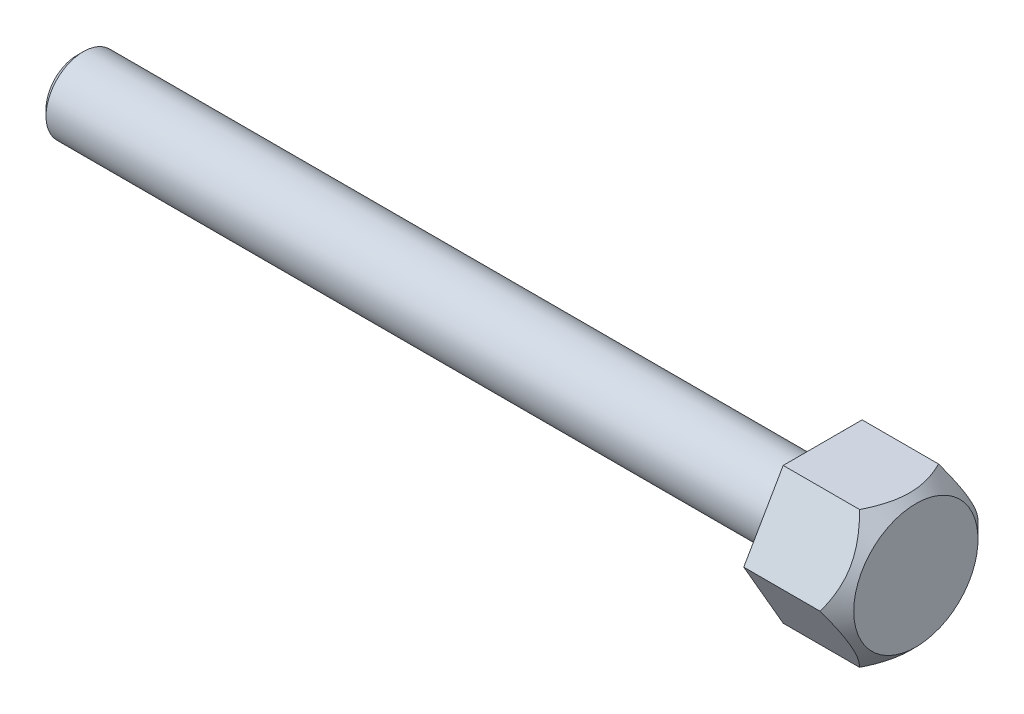
ISO-10303-21;
HEADER;
FILE_DESCRIPTION(('STEP AP214'),'2;1');
FILE_NAME('part.step','',(''),(''),'','','');
FILE_SCHEMA(('AUTOMOTIVE_DESIGN { 1 0 10303 214 1 1 1 1 }'));
ENDSEC;
DATA;
#1=APPLICATION_CONTEXT('core data for automotive mechanical design processes');
#2=APPLICATION_PROTOCOL_DEFINITION('international standard','automotive_design',2000,#1);
#3=PRODUCT_CONTEXT('',#1,'mechanical');
#4=PRODUCT('Part','Part','',(#3));
#5=PRODUCT_RELATED_PRODUCT_CATEGORY('part','',(#4));
#6=PRODUCT_DEFINITION_FORMATION('','',#4);
#7=PRODUCT_DEFINITION_CONTEXT('part definition',#1,'design');
#8=PRODUCT_DEFINITION('design','',#6,#7);
#9=PRODUCT_DEFINITION_SHAPE('','',#8);
#10=(LENGTH_UNIT() NAMED_UNIT(*) SI_UNIT(.MILLI.,.METRE.));
#11=(NAMED_UNIT(*) PLANE_ANGLE_UNIT() SI_UNIT($,.RADIAN.));
#12=(NAMED_UNIT(*) SI_UNIT($,.STERADIAN.) SOLID_ANGLE_UNIT());
#13=UNCERTAINTY_MEASURE_WITH_UNIT(LENGTH_MEASURE(1.E-05),#10,'distance_accuracy_value','');
#14=(GEOMETRIC_REPRESENTATION_CONTEXT(3) GLOBAL_UNCERTAINTY_ASSIGNED_CONTEXT((#13)) GLOBAL_UNIT_ASSIGNED_CONTEXT((#10,
#11,#12)) REPRESENTATION_CONTEXT('',''));
#15=CARTESIAN_POINT('',(0.,0.,0.));
#16=DIRECTION('',(0.,0.,1.));
#17=DIRECTION('',(1.,0.,0.));
#18=AXIS2_PLACEMENT_3D('',#15,#16,#17);
#19=CARTESIAN_POINT('',(-30.,0.,0.));
#20=DIRECTION('',(-1.,0.,0.));
#21=DIRECTION('',(0.,0.,1.));
#22=AXIS2_PLACEMENT_3D('',#19,#20,#21);
#23=CYLINDRICAL_SURFACE('',#22,1.5);
#24=CARTESIAN_POINT('',(-29.75,0.,0.));
#25=DIRECTION('',(-1.,0.,0.));
#26=DIRECTION('',(0.,0.,1.));
#27=AXIS2_PLACEMENT_3D('',#24,#25,#26);
#28=CIRCLE('',#27,1.5);
#29=CARTESIAN_POINT('',(-29.75,0.,1.5));
#30=VERTEX_POINT('',#29);
#31=EDGE_CURVE('E11',#30,#30,#28,.T.);
#32=ORIENTED_EDGE('',*,*,#31,.F.);
#33=EDGE_LOOP('',(#32));
#34=FACE_BOUND('',#33,.T.);
#35=CARTESIAN_POINT('',(0.,0.,0.));
#36=DIRECTION('',(-1.,0.,0.));
#37=DIRECTION('',(0.,0.,1.));
#38=AXIS2_PLACEMENT_3D('',#35,#36,#37);
#39=CIRCLE('',#38,1.5);
#40=CARTESIAN_POINT('',(0.,0.,1.5));
#41=VERTEX_POINT('',#40);
#42=EDGE_CURVE('E144',#41,#41,#39,.T.);
#43=ORIENTED_EDGE('',*,*,#42,.T.);
#44=EDGE_LOOP('',(#43));
#45=FACE_BOUND('',#44,.T.);
#46=ADVANCED_FACE('F40',(#34,#45),#23,.T.);
#47=CARTESIAN_POINT('',(-29.75,0.,0.));
#48=DIRECTION('',(1.,0.,0.));
#49=DIRECTION('',(0.,0.,-1.));
#50=AXIS2_PLACEMENT_3D('',#47,#48,#49);
#51=CONICAL_SURFACE('',#50,1.5,0.785398163397448);
#52=CARTESIAN_POINT('',(-30.,0.,0.));
#53=DIRECTION('',(-1.,0.,0.));
#54=DIRECTION('',(0.,0.,1.));
#55=AXIS2_PLACEMENT_3D('',#52,#53,#54);
#56=CIRCLE('',#55,1.25);
#57=CARTESIAN_POINT('',(-30.,0.,1.25));
#58=VERTEX_POINT('',#57);
#59=EDGE_CURVE('E48',#58,#58,#56,.T.);
#60=ORIENTED_EDGE('',*,*,#59,.F.);
#61=EDGE_LOOP('',(#60));
#62=FACE_BOUND('',#61,.T.);
#63=ORIENTED_EDGE('',*,*,#31,.T.);
#64=EDGE_LOOP('',(#63));
#65=FACE_BOUND('',#64,.T.);
#66=ADVANCED_FACE('F153',(#62,#65),#51,.T.);
#67=CARTESIAN_POINT('',(-30.,1.25,0.));
#68=DIRECTION('',(1.,0.,0.));
#69=DIRECTION('',(0.,0.,-1.));
#70=AXIS2_PLACEMENT_3D('',#67,#68,#69);
#71=PLANE('',#70);
#72=ORIENTED_EDGE('',*,*,#59,.T.);
#73=EDGE_LOOP('',(#72));
#74=FACE_BOUND('',#73,.T.);
#75=ADVANCED_FACE('F151',(#74),#71,.F.);
#76=CARTESIAN_POINT('',(3.75,0.,3.17542648054294));
#77=DIRECTION('',(0.,-0.499999999999997,-0.86602540378444));
#78=DIRECTION('',(0.,0.86602540378444,-0.499999999999997));
#79=AXIS2_PLACEMENT_3D('',#76,#77,#78);
#80=PLANE('',#79);
#81=DIRECTION('',(-1.,0.,0.));
#82=VECTOR('',#81,1.);
#83=CARTESIAN_POINT('',(3.75,0.,3.17542648054294));
#84=LINE('',#83,#82);
#85=CARTESIAN_POINT('',(3.07457351945706,0.,3.17542648054294));
#86=VERTEX_POINT('',#85);
#87=CARTESIAN_POINT('',(0.,0.,3.17542648054294));
#88=VERTEX_POINT('',#87);
#89=EDGE_CURVE('E114',#86,#88,#84,.T.);
#90=ORIENTED_EDGE('',*,*,#89,.F.);
#91=CARTESIAN_POINT('',(3.07445804310509,-0.000200000000009224,3.17554195059678));
#92=CARTESIAN_POINT('',(3.12898900635121,0.0943308997251447,3.12096451019372));
#93=CARTESIAN_POINT('',(3.1803172884173,0.190442479964874,3.06547446347008));
#94=CARTESIAN_POINT('',(3.27429815191942,0.386424562220422,2.95232415552349));
#95=CARTESIAN_POINT('',(3.31689844270939,0.486313702554468,2.89465313346251));
#96=CARTESIAN_POINT('',(3.38987357193505,0.687735384613639,2.77836227110502));
#97=CARTESIAN_POINT('',(3.42043183032172,0.789216629687054,2.71977204694419));
#98=CARTESIAN_POINT('',(3.4675131640141,0.994413197899172,2.60130175305014));
#99=CARTESIAN_POINT('',(3.4840713841007,1.09812225261288,2.54142530239377));
#100=CARTESIAN_POINT('',(3.49901119212363,1.27685963791475,2.43823122487549));
#101=CARTESIAN_POINT('',(3.50122274739977,1.35165706066678,2.39504691271492));
#102=CARTESIAN_POINT('',(3.49749678241252,1.5011296348614,2.30874888176719));
#103=CARTESIAN_POINT('',(3.49155640529112,1.57580473425182,2.26563519303237));
#104=CARTESIAN_POINT('',(3.47186462039656,1.72444981947431,2.17981491306545));
#105=CARTESIAN_POINT('',(3.45810447507259,1.79841892228175,2.13710883164786));
#106=CARTESIAN_POINT('',(3.42352848138478,1.94507802102905,2.052435161507));
#107=CARTESIAN_POINT('',(3.40271317393563,2.01776811458044,2.01046751642768));
#108=CARTESIAN_POINT('',(3.34091972875155,2.20395465431229,1.90297266759402));
#109=CARTESIAN_POINT('',(3.29528419147609,2.31629676656897,1.83811191884129));
#110=CARTESIAN_POINT('',(3.21824536067568,2.48148610419533,1.74273981029546));
#111=CARTESIAN_POINT('',(3.19117749248003,2.53592338410088,1.71131043208804));
#112=CARTESIAN_POINT('',(3.13457434830668,2.64378961648056,1.64903383378716));
#113=CARTESIAN_POINT('',(3.10504058686413,2.69721916353136,1.6181862704147));
#114=CARTESIAN_POINT('',(3.07445804310508,2.7502,1.58759777021764));
#115=B_SPLINE_CURVE_WITH_KNOTS('',3,(#91,#92,#93,#94,#95,#96,#97,#98,#99,#100,#101,#102,#103,
#104,#105,#106,#107,#108,#109,#110,#111,#112,#113,#114),.UNSPECIFIED.,.F.,.F.,(4,2,2,2,2,2,2,2,
2,2,2,4),(0.,0.366307821078204,0.734749902229763,1.09734036165939,1.45901787214334,
1.71784182927394,1.97675651485026,2.23596107357796,2.49514576375462,2.90682558871158,
3.11210731416953,3.31726387159445),.UNSPECIFIED.);
#116=CARTESIAN_POINT('',(3.07457351945706,2.75,1.58771324027148));
#117=VERTEX_POINT('',#116);
#118=EDGE_CURVE('E106',#86,#117,#115,.T.);
#119=ORIENTED_EDGE('',*,*,#118,.T.);
#120=DIRECTION('',(-1.,0.,0.));
#121=VECTOR('',#120,1.);
#122=CARTESIAN_POINT('',(3.75,2.75,1.58771324027148));
#123=LINE('',#122,#121);
#124=CARTESIAN_POINT('',(0.,2.75,1.58771324027148));
#125=VERTEX_POINT('',#124);
#126=EDGE_CURVE('E69',#117,#125,#123,.T.);
#127=ORIENTED_EDGE('',*,*,#126,.T.);
#128=DIRECTION('',(0.,-0.866025403784441,0.499999999999997));
#129=VECTOR('',#128,1.);
#130=CARTESIAN_POINT('',(0.,0.,3.17542648054294));
#131=LINE('',#130,#129);
#132=EDGE_CURVE('E116',#125,#88,#131,.T.);
#133=ORIENTED_EDGE('',*,*,#132,.T.);
#134=EDGE_LOOP('',(#90,#119,#127,#133));
#135=FACE_BOUND('',#134,.T.);
#136=ADVANCED_FACE('F113',(#135),#80,.F.);
#137=CARTESIAN_POINT('',(3.75,-2.75,1.58771324027147));
#138=DIRECTION('',(0.,0.500000000000002,-0.866025403784438));
#139=DIRECTION('',(0.,0.866025403784438,0.500000000000002));
#140=AXIS2_PLACEMENT_3D('',#137,#138,#139);
#141=PLANE('',#140);
#142=DIRECTION('',(-1.,0.,0.));
#143=VECTOR('',#142,1.);
#144=CARTESIAN_POINT('',(3.75,-2.75,1.58771324027147));
#145=LINE('',#144,#143);
#146=CARTESIAN_POINT('',(3.07457351945706,-2.75,1.58771324027147));
#147=VERTEX_POINT('',#146);
#148=CARTESIAN_POINT('',(0.,-2.75,1.58771324027147));
#149=VERTEX_POINT('',#148);
#150=EDGE_CURVE('E139',#147,#149,#145,.T.);
#151=ORIENTED_EDGE('',*,*,#150,.F.);
#152=CARTESIAN_POINT('',(3.07445804310508,-2.7502,1.58759777021763));
#153=CARTESIAN_POINT('',(3.12898900635121,-2.65566910027485,1.64217521062068));
#154=CARTESIAN_POINT('',(3.1803172884173,-2.55955752003512,1.69766525734433));
#155=CARTESIAN_POINT('',(3.27429815191942,-2.36357543777957,1.81081556529092));
#156=CARTESIAN_POINT('',(3.31689844270939,-2.26368629744553,1.8684865873519));
#157=CARTESIAN_POINT('',(3.38987357193505,-2.06226461538635,1.98477744970939));
#158=CARTESIAN_POINT('',(3.42043183032172,-1.96078337031294,2.04336767387022));
#159=CARTESIAN_POINT('',(3.4675131640141,-1.75558680210082,2.16183796776428));
#160=CARTESIAN_POINT('',(3.4840713841007,-1.65187774738711,2.22171441842064));
#161=CARTESIAN_POINT('',(3.49901119212363,-1.47314036208525,2.32490849593892));
#162=CARTESIAN_POINT('',(3.50122274739977,-1.39834293933321,2.3680928080995));
#163=CARTESIAN_POINT('',(3.49749678241252,-1.24887036513859,2.45439083904723));
#164=CARTESIAN_POINT('',(3.49155640529112,-1.17419526574817,2.49750452778205));
#165=CARTESIAN_POINT('',(3.47186462039656,-1.02555018052568,2.58332480774897));
#166=CARTESIAN_POINT('',(3.45810447507259,-0.951581077718252,2.62603088916656));
#167=CARTESIAN_POINT('',(3.42352848138478,-0.804921978970943,2.71070455930742));
#168=CARTESIAN_POINT('',(3.40271317393563,-0.732231885419558,2.75267220438673));
#169=CARTESIAN_POINT('',(3.34091972875155,-0.546045345687715,2.8601670532204));
#170=CARTESIAN_POINT('',(3.29528419147609,-0.433703233431031,2.92502780197313));
#171=CARTESIAN_POINT('',(3.21824536067568,-0.268513895804676,3.02039991051896));
#172=CARTESIAN_POINT('',(3.19117749248003,-0.214076615899126,3.05182928872638));
#173=CARTESIAN_POINT('',(3.13457434830669,-0.106210383519449,3.11410588702726));
#174=CARTESIAN_POINT('',(3.10504058686414,-0.0527808364686495,3.14495345039972));
#175=CARTESIAN_POINT('',(3.07445804310508,0.000199999999990615,3.17554195059678));
#176=B_SPLINE_CURVE_WITH_KNOTS('',3,(#152,#153,#154,#155,#156,#157,#158,#159,#160,#161,#162,
#163,#164,#165,#166,#167,#168,#169,#170,#171,#172,#173,#174,#175),.UNSPECIFIED.,.F.,.F.,(4,2,2,
2,2,2,2,2,2,2,2,4),(0.,0.366307821078203,0.734749902229761,1.09734036165938,1.45901787214334,
1.71784182927394,1.97675651485026,2.23596107357796,2.49514576375462,2.90682558871157,
3.11210731416952,3.31726387159444),.UNSPECIFIED.);
#177=EDGE_CURVE('E117',#147,#86,#176,.T.);
#178=ORIENTED_EDGE('',*,*,#177,.T.);
#179=ORIENTED_EDGE('',*,*,#89,.T.);
#180=DIRECTION('',(0.,-0.866025403784438,-0.500000000000002));
#181=VECTOR('',#180,1.);
#182=CARTESIAN_POINT('',(0.,-2.75,1.58771324027147));
#183=LINE('',#182,#181);
#184=EDGE_CURVE('E171',#88,#149,#183,.T.);
#185=ORIENTED_EDGE('',*,*,#184,.T.);
#186=EDGE_LOOP('',(#151,#178,#179,#185));
#187=FACE_BOUND('',#186,.T.);
#188=ADVANCED_FACE('F208',(#187),#141,.F.);
#189=CARTESIAN_POINT('',(3.75,-2.75,-1.58771324027147));
#190=DIRECTION('',(0.,1.,0.));
#191=DIRECTION('',(0.,0.,1.));
#192=AXIS2_PLACEMENT_3D('',#189,#190,#191);
#193=PLANE('',#192);
#194=DIRECTION('',(-1.,0.,0.));
#195=VECTOR('',#194,1.);
#196=CARTESIAN_POINT('',(3.75,-2.75,-1.58771324027147));
#197=LINE('',#196,#195);
#198=CARTESIAN_POINT('',(3.07457351945706,-2.75,-1.58771324027146));
#199=VERTEX_POINT('',#198);
#200=CARTESIAN_POINT('',(0.,-2.75,-1.58771324027147));
#201=VERTEX_POINT('',#200);
#202=EDGE_CURVE('E136',#199,#201,#197,.T.);
#203=ORIENTED_EDGE('',*,*,#202,.F.);
#204=CARTESIAN_POINT('',(1.99796899816714,-2.75,-3.24303370943747));
#205=CARTESIAN_POINT('',(2.05792601351629,-2.75,-3.16440464354934));
#206=CARTESIAN_POINT('',(2.11732610366244,-2.75,-3.08534400989006));
#207=CARTESIAN_POINT('',(2.23476039442893,-2.75,-2.92618611607515));
#208=CARTESIAN_POINT('',(2.29279425913588,-2.75,-2.84608860833369));
#209=CARTESIAN_POINT('',(2.40765708305725,-2.75,-2.6840975876423));
#210=CARTESIAN_POINT('',(2.46447325222763,-2.75,-2.60219497539475));
#211=CARTESIAN_POINT('',(2.57606157049973,-2.75,-2.43701336834121));
#212=CARTESIAN_POINT('',(2.63083386198774,-2.75,-2.35373446999928));
#213=CARTESIAN_POINT('',(2.74111497586007,-2.75,-2.18048311482057));
#214=CARTESIAN_POINT('',(2.79646756057042,-2.75,-2.09041070178267));
#215=CARTESIAN_POINT('',(2.90362457119406,-2.75,-1.90818242797483));
#216=CARTESIAN_POINT('',(2.95542946223493,-2.75,-1.81602684243877));
#217=CARTESIAN_POINT('',(3.05440622300766,-2.75,-1.62958382628412));
#218=CARTESIAN_POINT('',(3.1015910729887,-2.75,-1.53530334084137));
#219=CARTESIAN_POINT('',(3.19026228978302,-2.75,-1.34412102412683));
#220=CARTESIAN_POINT('',(3.23175129415731,-2.75,-1.24722043119359));
#221=CARTESIAN_POINT('',(3.30411968595675,-2.75,-1.05948785067354));
#222=CARTESIAN_POINT('',(3.33561858326727,-2.75,-0.968897149313561));
#223=CARTESIAN_POINT('',(3.39135824728334,-2.75,-0.785467841373158));
#224=CARTESIAN_POINT('',(3.41559853460604,-2.75,-0.692629086761245));
#225=CARTESIAN_POINT('',(3.45512777684662,-2.75,-0.50683975692026));
#226=CARTESIAN_POINT('',(3.47057487632076,-2.75,-0.413923395972729));
#227=CARTESIAN_POINT('',(3.49220567685045,-2.75,-0.22701279953092));
#228=CARTESIAN_POINT('',(3.49839113663418,-2.75,-0.133018772095714));
#229=CARTESIAN_POINT('',(3.50100371070673,-2.75,0.0513429538859794));
#230=CARTESIAN_POINT('',(3.49781117045462,-2.75,0.141705353642122));
#231=CARTESIAN_POINT('',(3.48270177246004,-2.75,0.321692287968609));
#232=CARTESIAN_POINT('',(3.4707840947253,-2.75,0.41131675238684));
#233=CARTESIAN_POINT('',(3.43868525691676,-2.75,0.590699065944813));
#234=CARTESIAN_POINT('',(3.41836074081776,-2.75,0.680430876320569));
#235=CARTESIAN_POINT('',(3.37055150794747,-2.75,0.857919963832991));
#236=CARTESIAN_POINT('',(3.34306729139305,-2.75,0.945677378446888));
#237=CARTESIAN_POINT('',(3.24716604265501,-2.75,1.2186050784306));
#238=CARTESIAN_POINT('',(3.1679688089688,-2.75,1.40000061415541));
#239=CARTESIAN_POINT('',(3.03590694470477,-2.75,1.66546648497212));
#240=CARTESIAN_POINT('',(2.98957204231885,-2.75,1.75301456708629));
#241=CARTESIAN_POINT('',(2.89332337929579,-2.75,1.92612568568624));
#242=CARTESIAN_POINT('',(2.84341025493044,-2.75,2.0116890715227));
#243=CARTESIAN_POINT('',(2.74326865191949,-2.75,2.17686915216543));
#244=CARTESIAN_POINT('',(2.69317821419991,-2.75,2.25657049342917));
#245=CARTESIAN_POINT('',(2.59087486054964,-2.75,2.41460602096669));
#246=CARTESIAN_POINT('',(2.5386617847215,-2.75,2.49294010360777));
#247=CARTESIAN_POINT('',(2.43292123737265,-2.75,2.6477857504496));
#248=CARTESIAN_POINT('',(2.37940777564859,-2.75,2.72430692145753));
#249=CARTESIAN_POINT('',(2.27095458564275,-2.75,2.87630117770402));
#250=CARTESIAN_POINT('',(2.21601525425193,-2.75,2.95177454580816));
#251=CARTESIAN_POINT('',(2.16049241439691,-2.75,3.02680892900513));
#252=B_SPLINE_CURVE_WITH_KNOTS('',3,(#204,#205,#206,#207,#208,#209,#210,#211,#212,#213,#214,
#215,#216,#217,#218,#219,#220,#221,#222,#223,#224,#225,#226,#227,#228,#229,#230,#231,#232,#233,
#234,#235,#236,#237,#238,#239,#240,#241,#242,#243,#244,#245,#246,#247,#248,#249,#250,#251),
.UNSPECIFIED.,.F.,.F.,(4,2,2,2,2,2,2,2,2,2,2,2,2,2,2,2,2,2,2,2,2,2,2,4),(0.,0.296647452352641,
0.593367095252204,0.892381571184982,1.19137517730117,1.50847400391387,1.825531176732,
2.14167033508796,2.45766260229171,2.74514441288885,3.03264520555955,3.31479719971051,
3.59689560814222,3.86771287044473,4.1385555875406,4.41422075736493,4.68986667283603,
5.28181864775793,5.57895450339726,5.87603765340491,6.15840777135868,6.44079919969468,
6.72091143439138,7.00094651879013),.UNSPECIFIED.);
#253=EDGE_CURVE('E205',#199,#147,#252,.T.);
#254=ORIENTED_EDGE('',*,*,#253,.T.);
#255=ORIENTED_EDGE('',*,*,#150,.T.);
#256=DIRECTION('',(0.,0.,-1.));
#257=VECTOR('',#256,1.);
#258=CARTESIAN_POINT('',(0.,-2.75,-1.58771324027147));
#259=LINE('',#258,#257);
#260=EDGE_CURVE('E176',#149,#201,#259,.T.);
#261=ORIENTED_EDGE('',*,*,#260,.T.);
#262=EDGE_LOOP('',(#203,#254,#255,#261));
#263=FACE_BOUND('',#262,.T.);
#264=ADVANCED_FACE('F204',(#263),#193,.F.);
#265=CARTESIAN_POINT('',(3.75,0.,-3.17542648054294));
#266=DIRECTION('',(0.,0.500000000000003,0.866025403784437));
#267=DIRECTION('',(0.,-0.866025403784437,0.500000000000003));
#268=AXIS2_PLACEMENT_3D('',#265,#266,#267);
#269=PLANE('',#268);
#270=DIRECTION('',(-1.,0.,0.));
#271=VECTOR('',#270,1.);
#272=CARTESIAN_POINT('',(3.75,0.,-3.17542648054294));
#273=LINE('',#272,#271);
#274=CARTESIAN_POINT('',(3.07457351945706,0.,-3.17542648054294));
#275=VERTEX_POINT('',#274);
#276=CARTESIAN_POINT('',(0.,0.,-3.17542648054294));
#277=VERTEX_POINT('',#276);
#278=EDGE_CURVE('E128',#275,#277,#273,.T.);
#279=ORIENTED_EDGE('',*,*,#278,.F.);
#280=CARTESIAN_POINT('',(3.07445804310509,0.000199999999981359,-3.17554195059677));
#281=CARTESIAN_POINT('',(3.12898900635121,-0.0943308997251722,-3.12096451019372));
#282=CARTESIAN_POINT('',(3.18031728841731,-0.190442479964901,-3.06547446347007));
#283=CARTESIAN_POINT('',(3.27429815191942,-0.386424562220447,-2.95232415552349));
#284=CARTESIAN_POINT('',(3.31689844270939,-0.486313702554493,-2.8946531334625));
#285=CARTESIAN_POINT('',(3.38987357193505,-0.687735384613663,-2.77836227110501));
#286=CARTESIAN_POINT('',(3.42043183032172,-0.789216629687077,-2.71977204694418));
#287=CARTESIAN_POINT('',(3.4675131640141,-0.994413197899193,-2.60130175305013));
#288=CARTESIAN_POINT('',(3.4840713841007,-1.0981222526129,-2.54142530239376));
#289=CARTESIAN_POINT('',(3.49901119212363,-1.27685963791477,-2.43823122487548));
#290=CARTESIAN_POINT('',(3.50122274739977,-1.3516570606668,-2.3950469127149));
#291=CARTESIAN_POINT('',(3.49749678241252,-1.50112963486142,-2.30874888176717));
#292=CARTESIAN_POINT('',(3.49155640529112,-1.57580473425184,-2.26563519303235));
#293=CARTESIAN_POINT('',(3.47186462039656,-1.72444981947433,-2.17981491306543));
#294=CARTESIAN_POINT('',(3.45810447507259,-1.79841892228176,-2.13710883164785));
#295=CARTESIAN_POINT('',(3.42352848138478,-1.94507802102907,-2.05243516150698));
#296=CARTESIAN_POINT('',(3.40271317393563,-2.01776811458046,-2.01046751642767));
#297=CARTESIAN_POINT('',(3.34091972875155,-2.2039546543123,-1.902972667594));
#298=CARTESIAN_POINT('',(3.29528419147609,-2.31629676656898,-1.83811191884127));
#299=CARTESIAN_POINT('',(3.21824536067568,-2.48148610419534,-1.74273981029544));
#300=CARTESIAN_POINT('',(3.19117749248004,-2.53592338410089,-1.71131043208802));
#301=CARTESIAN_POINT('',(3.13457434830669,-2.64378961648056,-1.64903383378714));
#302=CARTESIAN_POINT('',(3.10504058686414,-2.69721916353136,-1.61818627041469));
#303=CARTESIAN_POINT('',(3.07445804310509,-2.7502,-1.58759777021762));
#304=B_SPLINE_CURVE_WITH_KNOTS('',3,(#280,#281,#282,#283,#284,#285,#286,#287,#288,#289,#290,
#291,#292,#293,#294,#295,#296,#297,#298,#299,#300,#301,#302,#303),.UNSPECIFIED.,.F.,.F.,(4,2,2,
2,2,2,2,2,2,2,2,4),(0.,0.366307821078203,0.734749902229761,1.09734036165938,1.45901787214333,
1.71784182927394,1.97675651485026,2.23596107357795,2.49514576375461,2.90682558871157,
3.11210731416952,3.31726387159443),.UNSPECIFIED.);
#305=EDGE_CURVE('E201',#275,#199,#304,.T.);
#306=ORIENTED_EDGE('',*,*,#305,.T.);
#307=ORIENTED_EDGE('',*,*,#202,.T.);
#308=DIRECTION('',(0.,0.866025403784437,-0.500000000000003));
#309=VECTOR('',#308,1.);
#310=CARTESIAN_POINT('',(0.,0.,-3.17542648054294));
#311=LINE('',#310,#309);
#312=EDGE_CURVE('E188',#201,#277,#311,.T.);
#313=ORIENTED_EDGE('',*,*,#312,.T.);
#314=EDGE_LOOP('',(#279,#306,#307,#313));
#315=FACE_BOUND('',#314,.T.);
#316=ADVANCED_FACE('F198',(#315),#269,.F.);
#317=CARTESIAN_POINT('',(3.75,2.75,-1.58771324027147));
#318=DIRECTION('',(0.,-0.499999999999997,0.866025403784441));
#319=DIRECTION('',(0.,-0.866025403784441,-0.499999999999997));
#320=AXIS2_PLACEMENT_3D('',#317,#318,#319);
#321=PLANE('',#320);
#322=DIRECTION('',(-1.,0.,0.));
#323=VECTOR('',#322,1.);
#324=CARTESIAN_POINT('',(3.75,2.75,-1.58771324027147));
#325=LINE('',#324,#323);
#326=CARTESIAN_POINT('',(3.07457351945706,2.75,-1.58771324027147));
#327=VERTEX_POINT('',#326);
#328=CARTESIAN_POINT('',(0.,2.75,-1.58771324027147));
#329=VERTEX_POINT('',#328);
#330=EDGE_CURVE('E124',#327,#329,#325,.T.);
#331=ORIENTED_EDGE('',*,*,#330,.F.);
#332=CARTESIAN_POINT('',(3.07445804310508,2.7502,-1.58759777021763));
#333=CARTESIAN_POINT('',(3.12898900635121,2.65566910027484,-1.64217521062069));
#334=CARTESIAN_POINT('',(3.18031728841731,2.55955752003512,-1.69766525734433));
#335=CARTESIAN_POINT('',(3.27429815191942,2.36357543777957,-1.81081556529092));
#336=CARTESIAN_POINT('',(3.31689844270939,2.26368629744552,-1.8684865873519));
#337=CARTESIAN_POINT('',(3.38987357193505,2.06226461538635,-1.98477744970939));
#338=CARTESIAN_POINT('',(3.42043183032172,1.96078337031293,-2.04336767387022));
#339=CARTESIAN_POINT('',(3.46751316401411,1.75558680210081,-2.16183796776428));
#340=CARTESIAN_POINT('',(3.48407138410071,1.6518777473871,-2.22171441842064));
#341=CARTESIAN_POINT('',(3.49901119212364,1.47314036208523,-2.32490849593892));
#342=CARTESIAN_POINT('',(3.50122274739978,1.3983429393332,-2.3680928080995));
#343=CARTESIAN_POINT('',(3.49749678241253,1.24887036513858,-2.45439083904723));
#344=CARTESIAN_POINT('',(3.49155640529113,1.17419526574816,-2.49750452778205));
#345=CARTESIAN_POINT('',(3.47186462039657,1.02555018052567,-2.58332480774897));
#346=CARTESIAN_POINT('',(3.4581044750726,0.951581077718235,-2.62603088916655));
#347=CARTESIAN_POINT('',(3.42352848138479,0.804921978970927,-2.71070455930742));
#348=CARTESIAN_POINT('',(3.40271317393564,0.732231885419541,-2.75267220438673));
#349=CARTESIAN_POINT('',(3.34091972875156,0.546045345687696,-2.86016705322039));
#350=CARTESIAN_POINT('',(3.2952841914761,0.43370323343101,-2.92502780197312));
#351=CARTESIAN_POINT('',(3.21824536067569,0.268513895804652,-3.02039991051895));
#352=CARTESIAN_POINT('',(3.19117749248004,0.214076615899101,-3.05182928872638));
#353=CARTESIAN_POINT('',(3.13457434830669,0.106210383519422,-3.11410588702725));
#354=CARTESIAN_POINT('',(3.10504058686414,0.0527808364686221,-3.14495345039971));
#355=CARTESIAN_POINT('',(3.07445804310509,-0.000200000000018948,-3.17554195059677));
#356=B_SPLINE_CURVE_WITH_KNOTS('',3,(#332,#333,#334,#335,#336,#337,#338,#339,#340,#341,#342,
#343,#344,#345,#346,#347,#348,#349,#350,#351,#352,#353,#354,#355),.UNSPECIFIED.,.F.,.F.,(4,2,2,
2,2,2,2,2,2,2,2,4),(0.,0.366307821078207,0.734749902229769,1.0973403616594,1.45901787214335,
1.71784182927396,1.97675651485027,2.23596107357797,2.49514576375463,2.90682558871159,
3.11210731416954,3.31726387159446),.UNSPECIFIED.);
#357=EDGE_CURVE('E58',#327,#275,#356,.T.);
#358=ORIENTED_EDGE('',*,*,#357,.T.);
#359=ORIENTED_EDGE('',*,*,#278,.T.);
#360=DIRECTION('',(0.,0.866025403784441,0.499999999999997));
#361=VECTOR('',#360,1.);
#362=CARTESIAN_POINT('',(0.,2.75,-1.58771324027147));
#363=LINE('',#362,#361);
#364=EDGE_CURVE('E130',#277,#329,#363,.T.);
#365=ORIENTED_EDGE('',*,*,#364,.T.);
#366=EDGE_LOOP('',(#331,#358,#359,#365));
#367=FACE_BOUND('',#366,.T.);
#368=ADVANCED_FACE('F194',(#367),#321,.F.);
#369=CARTESIAN_POINT('',(3.75,2.75,1.58771324027148));
#370=DIRECTION('',(0.,-1.,0.));
#371=DIRECTION('',(0.,0.,-1.));
#372=AXIS2_PLACEMENT_3D('',#369,#370,#371);
#373=PLANE('',#372);
#374=ORIENTED_EDGE('',*,*,#126,.F.);
#375=CARTESIAN_POINT('',(1.99796899816714,2.75,-3.24303370943747));
#376=CARTESIAN_POINT('',(2.05792601351629,2.75,-3.16440464354934));
#377=CARTESIAN_POINT('',(2.11732610366244,2.75,-3.08534400989006));
#378=CARTESIAN_POINT('',(2.23476039442893,2.75,-2.92618611607515));
#379=CARTESIAN_POINT('',(2.29279425913589,2.75,-2.84608860833369));
#380=CARTESIAN_POINT('',(2.40765708305725,2.75,-2.6840975876423));
#381=CARTESIAN_POINT('',(2.46447325222764,2.75,-2.60219497539475));
#382=CARTESIAN_POINT('',(2.57606157049973,2.75,-2.43701336834121));
#383=CARTESIAN_POINT('',(2.63083386198774,2.75,-2.35373446999928));
#384=CARTESIAN_POINT('',(2.74111497586007,2.75,-2.18048311482057));
#385=CARTESIAN_POINT('',(2.79646756057042,2.75,-2.09041070178267));
#386=CARTESIAN_POINT('',(2.90362457119406,2.75,-1.90818242797483));
#387=CARTESIAN_POINT('',(2.95542946223493,2.75,-1.81602684243877));
#388=CARTESIAN_POINT('',(3.05440622300766,2.75,-1.62958382628412));
#389=CARTESIAN_POINT('',(3.1015910729887,2.75,-1.53530334084137));
#390=CARTESIAN_POINT('',(3.19026228978302,2.75,-1.34412102412683));
#391=CARTESIAN_POINT('',(3.23175129415731,2.75,-1.24722043119359));
#392=CARTESIAN_POINT('',(3.30411968595675,2.75,-1.05948785067354));
#393=CARTESIAN_POINT('',(3.33561858326727,2.75,-0.968897149313561));
#394=CARTESIAN_POINT('',(3.39135824728334,2.75,-0.785467841373158));
#395=CARTESIAN_POINT('',(3.41559853460604,2.75,-0.692629086761245));
#396=CARTESIAN_POINT('',(3.45512777684662,2.75,-0.506839756920261));
#397=CARTESIAN_POINT('',(3.47057487632076,2.75,-0.41392339597273));
#398=CARTESIAN_POINT('',(3.49220567685045,2.75,-0.22701279953092));
#399=CARTESIAN_POINT('',(3.49839113663418,2.75,-0.133018772095714));
#400=CARTESIAN_POINT('',(3.50100371070673,2.75,0.0513429538859797));
#401=CARTESIAN_POINT('',(3.49781117045462,2.75,0.141705353642122));
#402=CARTESIAN_POINT('',(3.48270177246004,2.75,0.321692287968609));
#403=CARTESIAN_POINT('',(3.4707840947253,2.75,0.41131675238684));
#404=CARTESIAN_POINT('',(3.43868525691676,2.75,0.590699065944813));
#405=CARTESIAN_POINT('',(3.41836074081776,2.75,0.68043087632057));
#406=CARTESIAN_POINT('',(3.37055150794747,2.75,0.857919963832992));
#407=CARTESIAN_POINT('',(3.34306729139305,2.75,0.945677378446888));
#408=CARTESIAN_POINT('',(3.24716604265501,2.75,1.2186050784306));
#409=CARTESIAN_POINT('',(3.1679688089688,2.75,1.40000061415541));
#410=CARTESIAN_POINT('',(3.03590694470477,2.75,1.66546648497212));
#411=CARTESIAN_POINT('',(2.98957204231885,2.75,1.75301456708629));
#412=CARTESIAN_POINT('',(2.89332337929579,2.75,1.92612568568624));
#413=CARTESIAN_POINT('',(2.84341025493044,2.75,2.0116890715227));
#414=CARTESIAN_POINT('',(2.74326865191949,2.75,2.17686915216543));
#415=CARTESIAN_POINT('',(2.69317821419991,2.75,2.25657049342917));
#416=CARTESIAN_POINT('',(2.59087486054964,2.75,2.41460602096669));
#417=CARTESIAN_POINT('',(2.5386617847215,2.75,2.49294010360777));
#418=CARTESIAN_POINT('',(2.43292123737265,2.75,2.6477857504496));
#419=CARTESIAN_POINT('',(2.37940777564859,2.75,2.72430692145753));
#420=CARTESIAN_POINT('',(2.27095458564275,2.75,2.87630117770402));
#421=CARTESIAN_POINT('',(2.21601525425193,2.75,2.95177454580816));
#422=CARTESIAN_POINT('',(2.16049241439691,2.75,3.02680892900513));
#423=B_SPLINE_CURVE_WITH_KNOTS('',3,(#375,#376,#377,#378,#379,#380,#381,#382,#383,#384,#385,
#386,#387,#388,#389,#390,#391,#392,#393,#394,#395,#396,#397,#398,#399,#400,#401,#402,#403,#404,
#405,#406,#407,#408,#409,#410,#411,#412,#413,#414,#415,#416,#417,#418,#419,#420,#421,#422),
.UNSPECIFIED.,.F.,.F.,(4,2,2,2,2,2,2,2,2,2,2,2,2,2,2,2,2,2,2,2,2,2,2,4),(0.,0.29664745235264,
0.593367095252202,0.892381571184981,1.19137517730117,1.50847400391387,1.825531176732,
2.14167033508795,2.45766260229171,2.74514441288885,3.03264520555955,3.3147971997105,
3.59689560814222,3.86771287044473,4.13855558754059,4.41422075736492,4.68986667283602,
5.28181864775793,5.57895450339725,5.8760376534049,6.15840777135868,6.44079919969468,
6.72091143439137,7.00094651879013),.UNSPECIFIED.);
#424=EDGE_CURVE('E104',#117,#327,#423,.F.);
#425=ORIENTED_EDGE('',*,*,#424,.T.);
#426=ORIENTED_EDGE('',*,*,#330,.T.);
#427=DIRECTION('',(0.,0.,1.));
#428=VECTOR('',#427,1.);
#429=CARTESIAN_POINT('',(0.,2.75,1.58771324027148));
#430=LINE('',#429,#428);
#431=EDGE_CURVE('E122',#329,#125,#430,.T.);
#432=ORIENTED_EDGE('',*,*,#431,.T.);
#433=EDGE_LOOP('',(#374,#425,#426,#432));
#434=FACE_BOUND('',#433,.T.);
#435=ADVANCED_FACE('F120',(#434),#373,.F.);
#436=CARTESIAN_POINT('',(0.,0.,0.));
#437=DIRECTION('',(-1.,0.,0.));
#438=DIRECTION('',(0.,0.,1.));
#439=AXIS2_PLACEMENT_3D('',#436,#437,#438);
#440=PLANE('',#439);
#441=ORIENTED_EDGE('',*,*,#42,.F.);
#442=EDGE_LOOP('',(#441));
#443=FACE_BOUND('',#442,.T.);
#444=ORIENTED_EDGE('',*,*,#132,.F.);
#445=ORIENTED_EDGE('',*,*,#431,.F.);
#446=ORIENTED_EDGE('',*,*,#364,.F.);
#447=ORIENTED_EDGE('',*,*,#312,.F.);
#448=ORIENTED_EDGE('',*,*,#260,.F.);
#449=ORIENTED_EDGE('',*,*,#184,.F.);
#450=EDGE_LOOP('',(#444,#445,#446,#447,#448,#449));
#451=FACE_BOUND('',#450,.T.);
#452=ADVANCED_FACE('F162',(#443,#451),#440,.T.);
#453=CARTESIAN_POINT('',(3.5,0.,0.));
#454=DIRECTION('',(-1.,0.,0.));
#455=DIRECTION('',(0.,0.,1.));
#456=AXIS2_PLACEMENT_3D('',#453,#454,#455);
#457=CONICAL_SURFACE('',#456,2.75,0.785398163397449);
#458=CARTESIAN_POINT('',(3.75,0.,0.));
#459=DIRECTION('',(-1.,0.,0.));
#460=DIRECTION('',(0.,0.,1.));
#461=AXIS2_PLACEMENT_3D('',#458,#459,#460);
#462=CIRCLE('',#461,2.5);
#463=CARTESIAN_POINT('',(3.75,0.,2.5));
#464=VERTEX_POINT('',#463);
#465=EDGE_CURVE('E43',#464,#464,#462,.F.);
#466=ORIENTED_EDGE('',*,*,#465,.F.);
#467=EDGE_LOOP('',(#466));
#468=FACE_BOUND('',#467,.T.);
#469=ORIENTED_EDGE('',*,*,#177,.F.);
#470=ORIENTED_EDGE('',*,*,#253,.F.);
#471=ORIENTED_EDGE('',*,*,#305,.F.);
#472=ORIENTED_EDGE('',*,*,#357,.F.);
#473=ORIENTED_EDGE('',*,*,#424,.F.);
#474=ORIENTED_EDGE('',*,*,#118,.F.);
#475=EDGE_LOOP('',(#469,#470,#471,#472,#473,#474));
#476=FACE_BOUND('',#475,.T.);
#477=ADVANCED_FACE('F105',(#468,#476),#457,.T.);
#478=CARTESIAN_POINT('',(3.75,0.,0.));
#479=DIRECTION('',(-1.,0.,0.));
#480=DIRECTION('',(0.,0.,1.));
#481=AXIS2_PLACEMENT_3D('',#478,#479,#480);
#482=PLANE('',#481);
#483=ORIENTED_EDGE('',*,*,#465,.T.);
#484=EDGE_LOOP('',(#483));
#485=FACE_BOUND('',#484,.T.);
#486=ADVANCED_FACE('F223',(#485),#482,.F.);
#487=CLOSED_SHELL('',(#46,#66,#75,#136,#188,#264,#316,#368,#435,#452,#477,#486));
#488=MANIFOLD_SOLID_BREP('B2',#487);
#489=ADVANCED_BREP_SHAPE_REPRESENTATION('',(#18,#488),#14);
#490=SHAPE_DEFINITION_REPRESENTATION(#9,#489);
ENDSEC;
END-ISO-10303-21;
